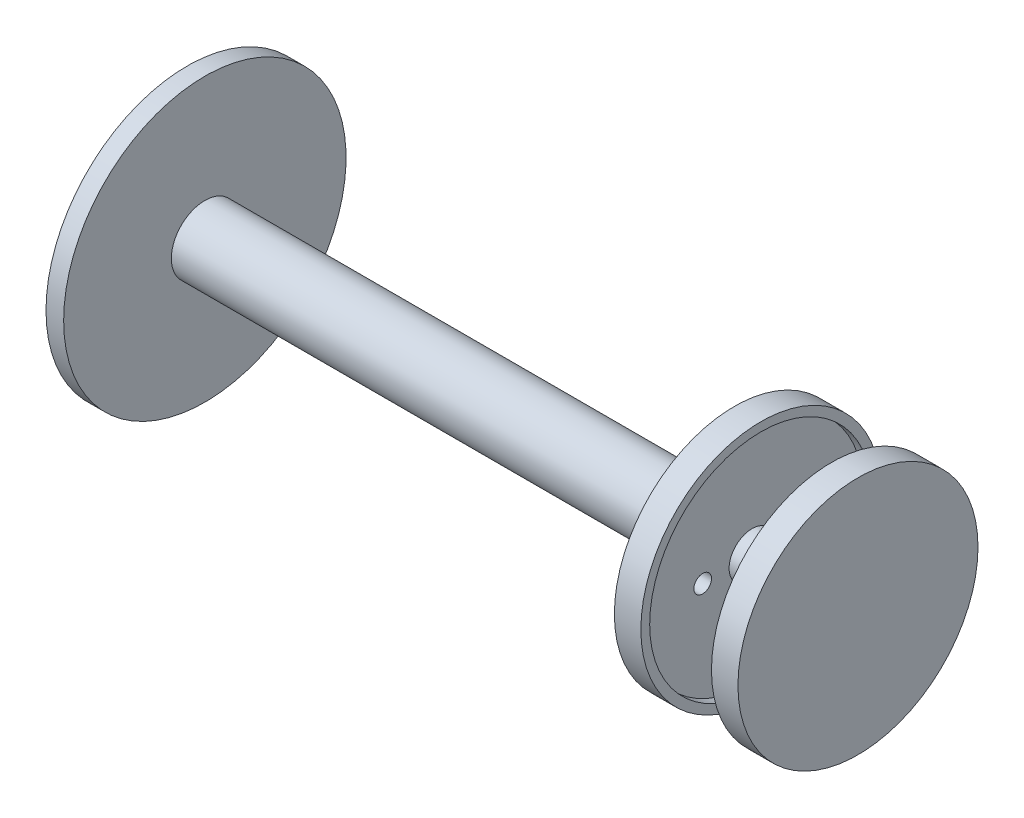
ISO-10303-21;
HEADER;
FILE_DESCRIPTION(('STEP AP214'),'2;1');
FILE_NAME('part.step','',(''),(''),'','','');
FILE_SCHEMA(('AUTOMOTIVE_DESIGN { 1 0 10303 214 1 1 1 1 }'));
ENDSEC;
DATA;
#1=APPLICATION_CONTEXT('core data for automotive mechanical design processes');
#2=APPLICATION_PROTOCOL_DEFINITION('international standard','automotive_design',2000,#1);
#3=PRODUCT_CONTEXT('',#1,'mechanical');
#4=PRODUCT('Part','Part','',(#3));
#5=PRODUCT_RELATED_PRODUCT_CATEGORY('part','',(#4));
#6=PRODUCT_DEFINITION_FORMATION('','',#4);
#7=PRODUCT_DEFINITION_CONTEXT('part definition',#1,'design');
#8=PRODUCT_DEFINITION('design','',#6,#7);
#9=PRODUCT_DEFINITION_SHAPE('','',#8);
#10=(LENGTH_UNIT() NAMED_UNIT(*) SI_UNIT(.MILLI.,.METRE.));
#11=(NAMED_UNIT(*) PLANE_ANGLE_UNIT() SI_UNIT($,.RADIAN.));
#12=(NAMED_UNIT(*) SI_UNIT($,.STERADIAN.) SOLID_ANGLE_UNIT());
#13=UNCERTAINTY_MEASURE_WITH_UNIT(LENGTH_MEASURE(1.E-05),#10,'distance_accuracy_value','');
#14=(GEOMETRIC_REPRESENTATION_CONTEXT(3) GLOBAL_UNCERTAINTY_ASSIGNED_CONTEXT((#13)) GLOBAL_UNIT_ASSIGNED_CONTEXT((#10,
#11,#12)) REPRESENTATION_CONTEXT('',''));
#15=CARTESIAN_POINT('',(0.,0.,0.));
#16=DIRECTION('',(0.,0.,1.));
#17=DIRECTION('',(1.,0.,0.));
#18=AXIS2_PLACEMENT_3D('',#15,#16,#17);
#19=CARTESIAN_POINT('',(-35.7804044999012,0.,0.));
#20=DIRECTION('',(1.,0.,0.));
#21=DIRECTION('',(0.,0.,-1.));
#22=AXIS2_PLACEMENT_3D('',#19,#20,#21);
#23=PLANE('',#22);
#24=CARTESIAN_POINT('',(-35.7804044999012,0.,27.9616164643847));
#25=DIRECTION('',(-1.,0.,0.));
#26=DIRECTION('',(0.,0.,1.));
#27=AXIS2_PLACEMENT_3D('',#24,#25,#26);
#28=CIRCLE('',#27,5.);
#29=CARTESIAN_POINT('',(-35.7804044999012,0.,32.9616164643847));
#30=VERTEX_POINT('',#29);
#31=EDGE_CURVE('E74',#30,#30,#28,.T.);
#32=ORIENTED_EDGE('',*,*,#31,.F.);
#33=EDGE_LOOP('',(#32));
#34=FACE_BOUND('',#33,.T.);
#35=CARTESIAN_POINT('',(-35.7804044999013,0.,0.));
#36=DIRECTION('',(1.,0.,0.));
#37=DIRECTION('',(0.,0.,-1.));
#38=AXIS2_PLACEMENT_3D('',#35,#36,#37);
#39=CIRCLE('',#38,19.);
#40=CARTESIAN_POINT('',(-35.7804044999013,0.,-19.));
#41=VERTEX_POINT('',#40);
#42=EDGE_CURVE('E10',#41,#41,#39,.F.);
#43=ORIENTED_EDGE('',*,*,#42,.F.);
#44=EDGE_LOOP('',(#43));
#45=FACE_BOUND('',#44,.T.);
#46=CARTESIAN_POINT('',(-35.7804044999012,0.,0.));
#47=DIRECTION('',(-1.,0.,0.));
#48=DIRECTION('',(0.,0.,1.));
#49=AXIS2_PLACEMENT_3D('',#46,#47,#48);
#50=CIRCLE('',#49,68.);
#51=CARTESIAN_POINT('',(-35.7804044999012,0.,68.));
#52=VERTEX_POINT('',#51);
#53=EDGE_CURVE('E36',#52,#52,#50,.T.);
#54=ORIENTED_EDGE('',*,*,#53,.T.);
#55=EDGE_LOOP('',(#54));
#56=FACE_BOUND('',#55,.T.);
#57=ADVANCED_FACE('F30',(#34,#45,#56),#23,.F.);
#58=CARTESIAN_POINT('',(-140.08260773227,0.,0.));
#59=DIRECTION('',(-1.,0.,0.));
#60=DIRECTION('',(0.,0.,1.));
#61=AXIS2_PLACEMENT_3D('',#58,#59,#60);
#62=CYLINDRICAL_SURFACE('',#61,68.);
#63=ORIENTED_EDGE('',*,*,#53,.F.);
#64=EDGE_LOOP('',(#63));
#65=FACE_BOUND('',#64,.T.);
#66=CARTESIAN_POINT('',(-20.7804044999012,0.,0.));
#67=DIRECTION('',(-1.,0.,0.));
#68=DIRECTION('',(0.,0.,1.));
#69=AXIS2_PLACEMENT_3D('',#66,#67,#68);
#70=CIRCLE('',#69,68.);
#71=CARTESIAN_POINT('',(-20.7804044999012,0.,68.));
#72=VERTEX_POINT('',#71);
#73=EDGE_CURVE('E40',#72,#72,#70,.T.);
#74=ORIENTED_EDGE('',*,*,#73,.T.);
#75=EDGE_LOOP('',(#74));
#76=FACE_BOUND('',#75,.T.);
#77=ADVANCED_FACE('F104',(#65,#76),#62,.T.);
#78=CARTESIAN_POINT('',(-20.7804044999012,68.,0.));
#79=DIRECTION('',(-1.,0.,0.));
#80=DIRECTION('',(0.,0.,1.));
#81=AXIS2_PLACEMENT_3D('',#78,#79,#80);
#82=PLANE('',#81);
#83=ORIENTED_EDGE('',*,*,#73,.F.);
#84=EDGE_LOOP('',(#83));
#85=FACE_BOUND('',#84,.T.);
#86=CARTESIAN_POINT('',(-20.7804044999012,0.,0.));
#87=DIRECTION('',(-1.,0.,0.));
#88=DIRECTION('',(0.,0.,1.));
#89=AXIS2_PLACEMENT_3D('',#86,#87,#88);
#90=CIRCLE('',#89,63.);
#91=CARTESIAN_POINT('',(-20.7804044999012,0.,63.));
#92=VERTEX_POINT('',#91);
#93=EDGE_CURVE('E44',#92,#92,#90,.T.);
#94=ORIENTED_EDGE('',*,*,#93,.T.);
#95=EDGE_LOOP('',(#94));
#96=FACE_BOUND('',#95,.T.);
#97=ADVANCED_FACE('F109',(#85,#96),#82,.F.);
#98=CARTESIAN_POINT('',(-140.08260773227,0.,0.));
#99=DIRECTION('',(-1.,0.,0.));
#100=DIRECTION('',(0.,0.,1.));
#101=AXIS2_PLACEMENT_3D('',#98,#99,#100);
#102=CYLINDRICAL_SURFACE('',#101,63.);
#103=ORIENTED_EDGE('',*,*,#93,.F.);
#104=EDGE_LOOP('',(#103));
#105=FACE_BOUND('',#104,.T.);
#106=CARTESIAN_POINT('',(-25.7804044999012,0.,0.));
#107=DIRECTION('',(-1.,0.,0.));
#108=DIRECTION('',(0.,0.,1.));
#109=AXIS2_PLACEMENT_3D('',#106,#107,#108);
#110=CIRCLE('',#109,63.);
#111=CARTESIAN_POINT('',(-25.7804044999012,0.,63.));
#112=VERTEX_POINT('',#111);
#113=EDGE_CURVE('E49',#112,#112,#110,.T.);
#114=ORIENTED_EDGE('',*,*,#113,.T.);
#115=EDGE_LOOP('',(#114));
#116=FACE_BOUND('',#115,.T.);
#117=ADVANCED_FACE('F152',(#105,#116),#102,.F.);
#118=CARTESIAN_POINT('',(-25.7804044999012,63.,0.));
#119=DIRECTION('',(-1.,0.,0.));
#120=DIRECTION('',(0.,0.,1.));
#121=AXIS2_PLACEMENT_3D('',#118,#119,#120);
#122=PLANE('',#121);
#123=CARTESIAN_POINT('',(-25.7804044999012,0.,27.9616164643847));
#124=DIRECTION('',(-1.,0.,0.));
#125=DIRECTION('',(0.,0.,1.));
#126=AXIS2_PLACEMENT_3D('',#123,#124,#125);
#127=CIRCLE('',#126,5.);
#128=CARTESIAN_POINT('',(-25.7804044999012,0.,32.9616164643847));
#129=VERTEX_POINT('',#128);
#130=EDGE_CURVE('E73',#129,#129,#127,.T.);
#131=ORIENTED_EDGE('',*,*,#130,.T.);
#132=EDGE_LOOP('',(#131));
#133=FACE_BOUND('',#132,.T.);
#134=ORIENTED_EDGE('',*,*,#113,.F.);
#135=EDGE_LOOP('',(#134));
#136=FACE_BOUND('',#135,.T.);
#137=CARTESIAN_POINT('',(-25.7804044999012,0.,0.));
#138=DIRECTION('',(-1.,0.,0.));
#139=DIRECTION('',(0.,0.,1.));
#140=AXIS2_PLACEMENT_3D('',#137,#138,#139);
#141=CIRCLE('',#140,13.);
#142=CARTESIAN_POINT('',(-25.7804044999012,0.,13.));
#143=VERTEX_POINT('',#142);
#144=EDGE_CURVE('E52',#143,#143,#141,.T.);
#145=ORIENTED_EDGE('',*,*,#144,.T.);
#146=EDGE_LOOP('',(#145));
#147=FACE_BOUND('',#146,.T.);
#148=ADVANCED_FACE('F148',(#133,#136,#147),#122,.F.);
#149=CARTESIAN_POINT('',(-140.08260773227,0.,0.));
#150=DIRECTION('',(-1.,0.,0.));
#151=DIRECTION('',(0.,0.,1.));
#152=AXIS2_PLACEMENT_3D('',#149,#150,#151);
#153=CYLINDRICAL_SURFACE('',#152,13.);
#154=ORIENTED_EDGE('',*,*,#144,.F.);
#155=EDGE_LOOP('',(#154));
#156=FACE_BOUND('',#155,.T.);
#157=CARTESIAN_POINT('',(24.2195955000988,0.,0.));
#158=DIRECTION('',(-1.,0.,0.));
#159=DIRECTION('',(0.,0.,1.));
#160=AXIS2_PLACEMENT_3D('',#157,#158,#159);
#161=CIRCLE('',#160,13.);
#162=CARTESIAN_POINT('',(24.2195955000988,0.,13.));
#163=VERTEX_POINT('',#162);
#164=EDGE_CURVE('E55',#163,#163,#161,.T.);
#165=ORIENTED_EDGE('',*,*,#164,.T.);
#166=EDGE_LOOP('',(#165));
#167=FACE_BOUND('',#166,.T.);
#168=ADVANCED_FACE('F144',(#156,#167),#153,.T.);
#169=CARTESIAN_POINT('',(24.2195955000988,13.,0.));
#170=DIRECTION('',(1.,0.,0.));
#171=DIRECTION('',(0.,0.,-1.));
#172=AXIS2_PLACEMENT_3D('',#169,#170,#171);
#173=PLANE('',#172);
#174=ORIENTED_EDGE('',*,*,#164,.F.);
#175=EDGE_LOOP('',(#174));
#176=FACE_BOUND('',#175,.T.);
#177=CARTESIAN_POINT('',(24.2195955000988,0.,0.));
#178=DIRECTION('',(-1.,0.,0.));
#179=DIRECTION('',(0.,0.,1.));
#180=AXIS2_PLACEMENT_3D('',#177,#178,#179);
#181=CIRCLE('',#180,63.);
#182=CARTESIAN_POINT('',(24.2195955000988,0.,63.));
#183=VERTEX_POINT('',#182);
#184=EDGE_CURVE('E58',#183,#183,#181,.T.);
#185=ORIENTED_EDGE('',*,*,#184,.T.);
#186=EDGE_LOOP('',(#185));
#187=FACE_BOUND('',#186,.T.);
#188=ADVANCED_FACE('F140',(#176,#187),#173,.F.);
#189=CARTESIAN_POINT('',(-140.08260773227,0.,0.));
#190=DIRECTION('',(-1.,0.,0.));
#191=DIRECTION('',(0.,0.,1.));
#192=AXIS2_PLACEMENT_3D('',#189,#190,#191);
#193=CYLINDRICAL_SURFACE('',#192,63.);
#194=ORIENTED_EDGE('',*,*,#184,.F.);
#195=EDGE_LOOP('',(#194));
#196=FACE_BOUND('',#195,.T.);
#197=CARTESIAN_POINT('',(19.2195955000987,0.,0.));
#198=DIRECTION('',(-1.,0.,0.));
#199=DIRECTION('',(0.,0.,1.));
#200=AXIS2_PLACEMENT_3D('',#197,#198,#199);
#201=CIRCLE('',#200,63.);
#202=CARTESIAN_POINT('',(19.2195955000987,0.,63.));
#203=VERTEX_POINT('',#202);
#204=EDGE_CURVE('E61',#203,#203,#201,.T.);
#205=ORIENTED_EDGE('',*,*,#204,.T.);
#206=EDGE_LOOP('',(#205));
#207=FACE_BOUND('',#206,.T.);
#208=ADVANCED_FACE('F136',(#196,#207),#193,.F.);
#209=CARTESIAN_POINT('',(19.2195955000988,63.,0.));
#210=DIRECTION('',(1.,0.,0.));
#211=DIRECTION('',(0.,0.,-1.));
#212=AXIS2_PLACEMENT_3D('',#209,#210,#211);
#213=PLANE('',#212);
#214=ORIENTED_EDGE('',*,*,#204,.F.);
#215=EDGE_LOOP('',(#214));
#216=FACE_BOUND('',#215,.T.);
#217=CARTESIAN_POINT('',(19.2195955000988,0.,0.));
#218=DIRECTION('',(-1.,0.,0.));
#219=DIRECTION('',(0.,0.,1.));
#220=AXIS2_PLACEMENT_3D('',#217,#218,#219);
#221=CIRCLE('',#220,68.);
#222=CARTESIAN_POINT('',(19.2195955000988,0.,68.));
#223=VERTEX_POINT('',#222);
#224=EDGE_CURVE('E64',#223,#223,#221,.T.);
#225=ORIENTED_EDGE('',*,*,#224,.T.);
#226=EDGE_LOOP('',(#225));
#227=FACE_BOUND('',#226,.T.);
#228=ADVANCED_FACE('F132',(#216,#227),#213,.F.);
#229=CARTESIAN_POINT('',(-140.08260773227,0.,0.));
#230=DIRECTION('',(-1.,0.,0.));
#231=DIRECTION('',(0.,0.,1.));
#232=AXIS2_PLACEMENT_3D('',#229,#230,#231);
#233=CYLINDRICAL_SURFACE('',#232,68.);
#234=ORIENTED_EDGE('',*,*,#224,.F.);
#235=EDGE_LOOP('',(#234));
#236=FACE_BOUND('',#235,.T.);
#237=CARTESIAN_POINT('',(34.2195955000987,0.,0.));
#238=DIRECTION('',(-1.,0.,0.));
#239=DIRECTION('',(0.,0.,1.));
#240=AXIS2_PLACEMENT_3D('',#237,#238,#239);
#241=CIRCLE('',#240,68.);
#242=CARTESIAN_POINT('',(34.2195955000987,0.,68.));
#243=VERTEX_POINT('',#242);
#244=EDGE_CURVE('E67',#243,#243,#241,.T.);
#245=ORIENTED_EDGE('',*,*,#244,.T.);
#246=EDGE_LOOP('',(#245));
#247=FACE_BOUND('',#246,.T.);
#248=ADVANCED_FACE('F128',(#236,#247),#233,.T.);
#249=CARTESIAN_POINT('',(34.2195955000987,68.,0.));
#250=DIRECTION('',(-1.,0.,0.));
#251=DIRECTION('',(0.,0.,1.));
#252=AXIS2_PLACEMENT_3D('',#249,#250,#251);
#253=PLANE('',#252);
#254=ORIENTED_EDGE('',*,*,#244,.F.);
#255=EDGE_LOOP('',(#254));
#256=FACE_BOUND('',#255,.T.);
#257=ADVANCED_FACE('F121',(#256),#253,.F.);
#258=CARTESIAN_POINT('',(-335.780404499901,0.,0.));
#259=DIRECTION('',(1.,0.,0.));
#260=DIRECTION('',(0.,0.,-1.));
#261=AXIS2_PLACEMENT_3D('',#258,#259,#260);
#262=CYLINDRICAL_SURFACE('',#261,19.);
#263=CARTESIAN_POINT('',(-335.780404499901,0.,0.));
#264=DIRECTION('',(-1.,0.,0.));
#265=DIRECTION('',(0.,0.,1.));
#266=AXIS2_PLACEMENT_3D('',#263,#264,#265);
#267=CIRCLE('',#266,19.);
#268=CARTESIAN_POINT('',(-335.780404499901,0.,19.));
#269=VERTEX_POINT('',#268);
#270=EDGE_CURVE('E70',#269,#269,#267,.T.);
#271=ORIENTED_EDGE('',*,*,#270,.F.);
#272=EDGE_LOOP('',(#271));
#273=FACE_BOUND('',#272,.T.);
#274=ORIENTED_EDGE('',*,*,#42,.T.);
#275=EDGE_LOOP('',(#274));
#276=FACE_BOUND('',#275,.T.);
#277=ADVANCED_FACE('F115',(#273,#276),#262,.T.);
#278=CARTESIAN_POINT('',(-25.7804044999012,0.,27.9616164643847));
#279=DIRECTION('',(-1.,0.,0.));
#280=DIRECTION('',(0.,0.,1.));
#281=AXIS2_PLACEMENT_3D('',#278,#279,#280);
#282=CYLINDRICAL_SURFACE('',#281,5.);
#283=ORIENTED_EDGE('',*,*,#130,.F.);
#284=EDGE_LOOP('',(#283));
#285=FACE_BOUND('',#284,.T.);
#286=ORIENTED_EDGE('',*,*,#31,.T.);
#287=EDGE_LOOP('',(#286));
#288=FACE_BOUND('',#287,.T.);
#289=ADVANCED_FACE('F91',(#285,#288),#282,.F.);
#290=CARTESIAN_POINT('',(-345.780404499901,0.,0.));
#291=DIRECTION('',(1.,0.,0.));
#292=DIRECTION('',(0.,0.,-1.));
#293=AXIS2_PLACEMENT_3D('',#290,#291,#292);
#294=CYLINDRICAL_SURFACE('',#293,80.);
#295=CARTESIAN_POINT('',(-345.780404499901,0.,0.));
#296=DIRECTION('',(-1.,0.,0.));
#297=DIRECTION('',(0.,0.,1.));
#298=AXIS2_PLACEMENT_3D('',#295,#296,#297);
#299=CIRCLE('',#298,80.);
#300=CARTESIAN_POINT('',(-345.780404499901,0.,80.));
#301=VERTEX_POINT('',#300);
#302=EDGE_CURVE('E77',#301,#301,#299,.T.);
#303=ORIENTED_EDGE('',*,*,#302,.F.);
#304=EDGE_LOOP('',(#303));
#305=FACE_BOUND('',#304,.T.);
#306=CARTESIAN_POINT('',(-335.780404499901,0.,0.));
#307=DIRECTION('',(-1.,0.,0.));
#308=DIRECTION('',(0.,0.,1.));
#309=AXIS2_PLACEMENT_3D('',#306,#307,#308);
#310=CIRCLE('',#309,80.);
#311=CARTESIAN_POINT('',(-335.780404499901,0.,80.));
#312=VERTEX_POINT('',#311);
#313=EDGE_CURVE('E80',#312,#312,#310,.T.);
#314=ORIENTED_EDGE('',*,*,#313,.T.);
#315=EDGE_LOOP('',(#314));
#316=FACE_BOUND('',#315,.T.);
#317=ADVANCED_FACE('F88',(#305,#316),#294,.T.);
#318=CARTESIAN_POINT('',(-345.780404499901,0.,0.));
#319=DIRECTION('',(-1.,0.,0.));
#320=DIRECTION('',(0.,0.,1.));
#321=AXIS2_PLACEMENT_3D('',#318,#319,#320);
#322=PLANE('',#321);
#323=ORIENTED_EDGE('',*,*,#302,.T.);
#324=EDGE_LOOP('',(#323));
#325=FACE_BOUND('',#324,.T.);
#326=ADVANCED_FACE('F86',(#325),#322,.T.);
#327=CARTESIAN_POINT('',(-335.780404499901,0.,0.));
#328=DIRECTION('',(-1.,0.,0.));
#329=DIRECTION('',(0.,0.,1.));
#330=AXIS2_PLACEMENT_3D('',#327,#328,#329);
#331=PLANE('',#330);
#332=ORIENTED_EDGE('',*,*,#270,.T.);
#333=EDGE_LOOP('',(#332));
#334=FACE_BOUND('',#333,.T.);
#335=ORIENTED_EDGE('',*,*,#313,.F.);
#336=EDGE_LOOP('',(#335));
#337=FACE_BOUND('',#336,.T.);
#338=ADVANCED_FACE('F95',(#334,#337),#331,.F.);
#339=CLOSED_SHELL('',(#57,#77,#97,#117,#148,#168,#188,#208,#228,#248,#257,#277,#289,#317,#326,#338));
#340=MANIFOLD_SOLID_BREP('B2',#339);
#341=ADVANCED_BREP_SHAPE_REPRESENTATION('',(#18,#340),#14);
#342=SHAPE_DEFINITION_REPRESENTATION(#9,#341);
ENDSEC;
END-ISO-10303-21;
